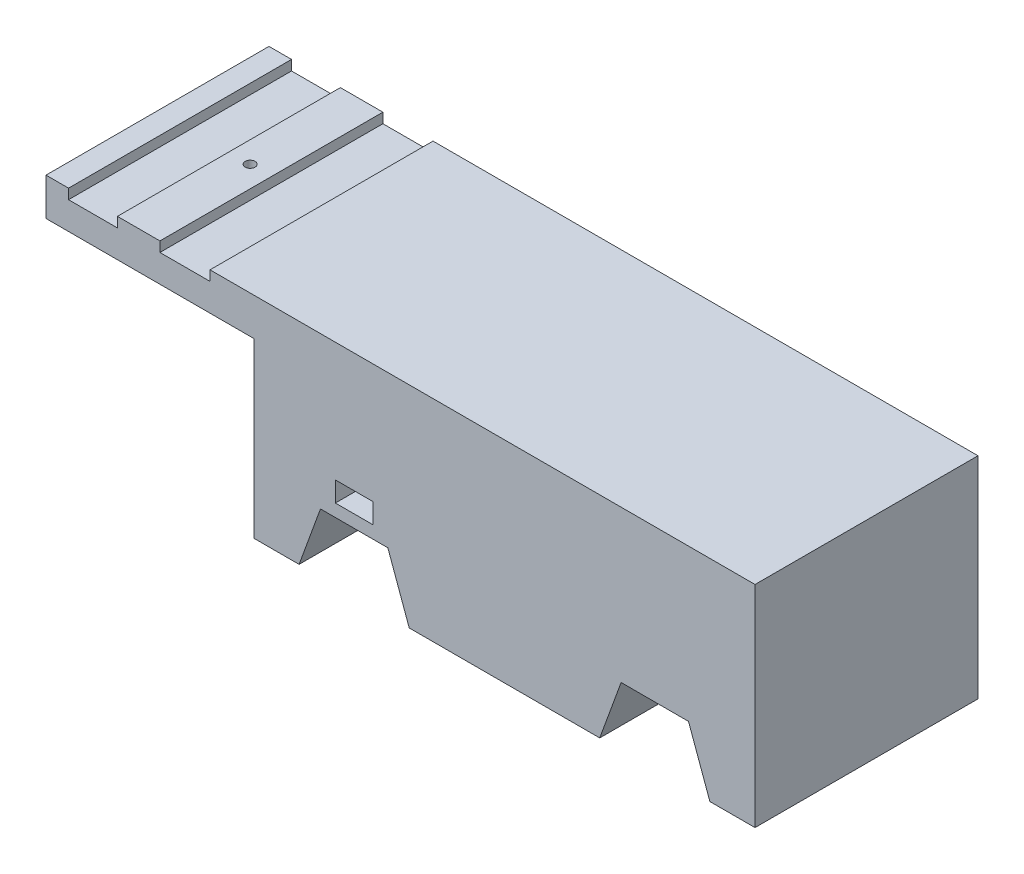
ISO-10303-21;
HEADER;
FILE_DESCRIPTION(('STEP AP214'),'2;1');
FILE_NAME('part.step','',(''),(''),'','','');
FILE_SCHEMA(('AUTOMOTIVE_DESIGN { 1 0 10303 214 1 1 1 1 }'));
ENDSEC;
DATA;
#1=APPLICATION_CONTEXT('core data for automotive mechanical design processes');
#2=APPLICATION_PROTOCOL_DEFINITION('international standard','automotive_design',2000,#1);
#3=PRODUCT_CONTEXT('',#1,'mechanical');
#4=PRODUCT('Part','Part','',(#3));
#5=PRODUCT_RELATED_PRODUCT_CATEGORY('part','',(#4));
#6=PRODUCT_DEFINITION_FORMATION('','',#4);
#7=PRODUCT_DEFINITION_CONTEXT('part definition',#1,'design');
#8=PRODUCT_DEFINITION('design','',#6,#7);
#9=PRODUCT_DEFINITION_SHAPE('','',#8);
#10=(LENGTH_UNIT() NAMED_UNIT(*) SI_UNIT(.MILLI.,.METRE.));
#11=(NAMED_UNIT(*) PLANE_ANGLE_UNIT() SI_UNIT($,.RADIAN.));
#12=(NAMED_UNIT(*) SI_UNIT($,.STERADIAN.) SOLID_ANGLE_UNIT());
#13=UNCERTAINTY_MEASURE_WITH_UNIT(LENGTH_MEASURE(1.E-05),#10,'distance_accuracy_value','');
#14=(GEOMETRIC_REPRESENTATION_CONTEXT(3) GLOBAL_UNCERTAINTY_ASSIGNED_CONTEXT((#13)) GLOBAL_UNIT_ASSIGNED_CONTEXT((#10,
#11,#12)) REPRESENTATION_CONTEXT('',''));
#15=CARTESIAN_POINT('',(0.,0.,0.));
#16=DIRECTION('',(0.,0.,1.));
#17=DIRECTION('',(1.,0.,0.));
#18=AXIS2_PLACEMENT_3D('',#15,#16,#17);
#19=CARTESIAN_POINT('',(-53.4485357832084,-45.6,303.148107475504));
#20=DIRECTION('',(0.,-1.,0.));
#21=DIRECTION('',(0.,0.,-1.));
#22=AXIS2_PLACEMENT_3D('',#19,#20,#21);
#23=PLANE('',#22);
#24=DIRECTION('',(0.,0.,-1.));
#25=VECTOR('',#24,1.);
#26=CARTESIAN_POINT('',(-53.4485357832084,-45.6,303.148107475504));
#27=LINE('',#26,#25);
#28=CARTESIAN_POINT('',(-53.4485357832084,-45.6,89.));
#29=VERTEX_POINT('',#28);
#30=CARTESIAN_POINT('',(-53.4485357832084,-45.6,64.5));
#31=VERTEX_POINT('',#30);
#32=EDGE_CURVE('E393',#29,#31,#27,.T.);
#33=ORIENTED_EDGE('',*,*,#32,.T.);
#34=DIRECTION('',(1.,0.,0.));
#35=VECTOR('',#34,1.);
#36=CARTESIAN_POINT('',(-53.4485357832084,-45.6,64.5));
#37=LINE('',#36,#35);
#38=CARTESIAN_POINT('',(-26.5514642167916,-45.6,64.5));
#39=VERTEX_POINT('',#38);
#40=EDGE_CURVE('E296',#31,#39,#37,.T.);
#41=ORIENTED_EDGE('',*,*,#40,.T.);
#42=DIRECTION('',(0.,0.,-1.));
#43=VECTOR('',#42,1.);
#44=CARTESIAN_POINT('',(-26.5514642167916,-45.6,303.148107475504));
#45=LINE('',#44,#43);
#46=CARTESIAN_POINT('',(-26.5514642167916,-45.6,89.));
#47=VERTEX_POINT('',#46);
#48=EDGE_CURVE('E399',#47,#39,#45,.T.);
#49=ORIENTED_EDGE('',*,*,#48,.F.);
#50=DIRECTION('',(-1.,0.,0.));
#51=VECTOR('',#50,1.);
#52=CARTESIAN_POINT('',(-53.4485357832084,-45.6,89.));
#53=LINE('',#52,#51);
#54=EDGE_CURVE('E394',#47,#29,#53,.T.);
#55=ORIENTED_EDGE('',*,*,#54,.T.);
#56=EDGE_LOOP('',(#33,#41,#49,#55));
#57=FACE_BOUND('',#56,.T.);
#58=ADVANCED_FACE('F38',(#57),#23,.T.);
#59=CARTESIAN_POINT('',(-283.,15.,89.));
#60=DIRECTION('',(1.,0.,0.));
#61=DIRECTION('',(0.,0.,-1.));
#62=AXIS2_PLACEMENT_3D('',#59,#60,#61);
#63=PLANE('',#62);
#64=DIRECTION('',(0.,-1.,0.));
#65=VECTOR('',#64,1.);
#66=CARTESIAN_POINT('',(-283.,15.,0.));
#67=LINE('',#66,#65);
#68=CARTESIAN_POINT('',(-283.,15.,0.));
#69=VERTEX_POINT('',#68);
#70=CARTESIAN_POINT('',(-283.,0.,0.));
#71=VERTEX_POINT('',#70);
#72=EDGE_CURVE('E444',#69,#71,#67,.T.);
#73=ORIENTED_EDGE('',*,*,#72,.T.);
#74=DIRECTION('',(0.,0.,-1.));
#75=VECTOR('',#74,1.);
#76=CARTESIAN_POINT('',(-283.,0.,89.));
#77=LINE('',#76,#75);
#78=CARTESIAN_POINT('',(-283.,0.,89.));
#79=VERTEX_POINT('',#78);
#80=EDGE_CURVE('E560',#79,#71,#77,.T.);
#81=ORIENTED_EDGE('',*,*,#80,.F.);
#82=DIRECTION('',(0.,-1.,0.));
#83=VECTOR('',#82,1.);
#84=CARTESIAN_POINT('',(-283.,15.,89.));
#85=LINE('',#84,#83);
#86=CARTESIAN_POINT('',(-283.,15.,89.));
#87=VERTEX_POINT('',#86);
#88=EDGE_CURVE('E445',#87,#79,#85,.T.);
#89=ORIENTED_EDGE('',*,*,#88,.F.);
#90=DIRECTION('',(0.,0.,-1.));
#91=VECTOR('',#90,1.);
#92=CARTESIAN_POINT('',(-283.,15.,89.));
#93=LINE('',#92,#91);
#94=EDGE_CURVE('E484',#87,#69,#93,.T.);
#95=ORIENTED_EDGE('',*,*,#94,.T.);
#96=EDGE_LOOP('',(#73,#81,#89,#95));
#97=FACE_BOUND('',#96,.T.);
#98=ADVANCED_FACE('F40',(#97),#63,.F.);
#99=CARTESIAN_POINT('',(-283.,0.,89.));
#100=DIRECTION('',(0.,1.,0.));
#101=DIRECTION('',(0.,0.,1.));
#102=AXIS2_PLACEMENT_3D('',#99,#100,#101);
#103=PLANE('',#102);
#104=CARTESIAN_POINT('',(-246.015,0.,44.5));
#105=DIRECTION('',(0.,1.,0.));
#106=DIRECTION('',(0.,0.,1.));
#107=AXIS2_PLACEMENT_3D('',#104,#105,#106);
#108=CIRCLE('',#107,2.);
#109=CARTESIAN_POINT('',(-246.015,0.,46.5));
#110=VERTEX_POINT('',#109);
#111=EDGE_CURVE('E440',#110,#110,#108,.T.);
#112=ORIENTED_EDGE('',*,*,#111,.T.);
#113=EDGE_LOOP('',(#112));
#114=FACE_BOUND('',#113,.T.);
#115=DIRECTION('',(1.,0.,0.));
#116=VECTOR('',#115,1.);
#117=CARTESIAN_POINT('',(-283.,0.,0.));
#118=LINE('',#117,#116);
#119=CARTESIAN_POINT('',(-200.,0.,0.));
#120=VERTEX_POINT('',#119);
#121=EDGE_CURVE('E488',#71,#120,#118,.T.);
#122=ORIENTED_EDGE('',*,*,#121,.T.);
#123=DIRECTION('',(0.,0.,1.));
#124=VECTOR('',#123,1.);
#125=CARTESIAN_POINT('',(-200.,0.,89.));
#126=LINE('',#125,#124);
#127=CARTESIAN_POINT('',(-200.,0.,89.));
#128=VERTEX_POINT('',#127);
#129=EDGE_CURVE('E362',#120,#128,#126,.T.);
#130=ORIENTED_EDGE('',*,*,#129,.T.);
#131=DIRECTION('',(1.,0.,0.));
#132=VECTOR('',#131,1.);
#133=CARTESIAN_POINT('',(-283.,0.,89.));
#134=LINE('',#133,#132);
#135=EDGE_CURVE('E449',#79,#128,#134,.T.);
#136=ORIENTED_EDGE('',*,*,#135,.F.);
#137=ORIENTED_EDGE('',*,*,#80,.T.);
#138=EDGE_LOOP('',(#122,#130,#136,#137));
#139=FACE_BOUND('',#138,.T.);
#140=ADVANCED_FACE('F618',(#114,#139),#103,.F.);
#141=CARTESIAN_POINT('',(0.,0.,89.));
#142=DIRECTION('',(-1.,0.,0.));
#143=DIRECTION('',(0.,0.,1.));
#144=AXIS2_PLACEMENT_3D('',#141,#142,#143);
#145=PLANE('',#144);
#146=DIRECTION('',(0.,0.,-1.));
#147=VECTOR('',#146,1.);
#148=CARTESIAN_POINT('',(0.,15.,89.));
#149=LINE('',#148,#147);
#150=CARTESIAN_POINT('',(0.,15.,89.));
#151=VERTEX_POINT('',#150);
#152=CARTESIAN_POINT('',(0.,15.,0.));
#153=VERTEX_POINT('',#152);
#154=EDGE_CURVE('E556',#151,#153,#149,.T.);
#155=ORIENTED_EDGE('',*,*,#154,.F.);
#156=DIRECTION('',(0.,1.,0.));
#157=VECTOR('',#156,1.);
#158=CARTESIAN_POINT('',(0.,0.,89.));
#159=LINE('',#158,#157);
#160=CARTESIAN_POINT('',(0.,-69.0467957222246,89.));
#161=VERTEX_POINT('',#160);
#162=EDGE_CURVE('E454',#161,#151,#159,.T.);
#163=ORIENTED_EDGE('',*,*,#162,.F.);
#164=DIRECTION('',(0.,0.,-1.));
#165=VECTOR('',#164,1.);
#166=CARTESIAN_POINT('',(0.,-69.0467957222246,303.148107475504));
#167=LINE('',#166,#165);
#168=CARTESIAN_POINT('',(0.,-69.0467957222246,0.));
#169=VERTEX_POINT('',#168);
#170=EDGE_CURVE('E323',#161,#169,#167,.T.);
#171=ORIENTED_EDGE('',*,*,#170,.T.);
#172=DIRECTION('',(0.,1.,0.));
#173=VECTOR('',#172,1.);
#174=CARTESIAN_POINT('',(0.,0.,0.));
#175=LINE('',#174,#173);
#176=EDGE_CURVE('E492',#169,#153,#175,.T.);
#177=ORIENTED_EDGE('',*,*,#176,.T.);
#178=EDGE_LOOP('',(#155,#163,#171,#177));
#179=FACE_BOUND('',#178,.T.);
#180=ADVANCED_FACE('F680',(#179),#145,.F.);
#181=CARTESIAN_POINT('',(0.,15.,89.));
#182=DIRECTION('',(0.,-1.,0.));
#183=DIRECTION('',(1.,0.,0.));
#184=AXIS2_PLACEMENT_3D('',#181,#182,#183);
#185=PLANE('',#184);
#186=DIRECTION('',(-1.,0.,0.));
#187=VECTOR('',#186,1.);
#188=CARTESIAN_POINT('',(0.,15.,0.));
#189=LINE('',#188,#187);
#190=CARTESIAN_POINT('',(-217.53,15.,0.));
#191=VERTEX_POINT('',#190);
#192=EDGE_CURVE('E495',#153,#191,#189,.T.);
#193=ORIENTED_EDGE('',*,*,#192,.T.);
#194=DIRECTION('',(0.,0.,-1.));
#195=VECTOR('',#194,1.);
#196=CARTESIAN_POINT('',(-217.53,15.,89.));
#197=LINE('',#196,#195);
#198=CARTESIAN_POINT('',(-217.53,15.,89.));
#199=VERTEX_POINT('',#198);
#200=EDGE_CURVE('E552',#199,#191,#197,.T.);
#201=ORIENTED_EDGE('',*,*,#200,.F.);
#202=DIRECTION('',(-1.,0.,0.));
#203=VECTOR('',#202,1.);
#204=CARTESIAN_POINT('',(0.,15.,89.));
#205=LINE('',#204,#203);
#206=EDGE_CURVE('E457',#151,#199,#205,.T.);
#207=ORIENTED_EDGE('',*,*,#206,.F.);
#208=ORIENTED_EDGE('',*,*,#154,.T.);
#209=EDGE_LOOP('',(#193,#201,#207,#208));
#210=FACE_BOUND('',#209,.T.);
#211=ADVANCED_FACE('F676',(#210),#185,.F.);
#212=CARTESIAN_POINT('',(-217.53,15.,89.));
#213=DIRECTION('',(1.,0.,0.));
#214=DIRECTION('',(0.,0.,-1.));
#215=AXIS2_PLACEMENT_3D('',#212,#213,#214);
#216=PLANE('',#215);
#217=DIRECTION('',(0.,-1.,0.));
#218=VECTOR('',#217,1.);
#219=CARTESIAN_POINT('',(-217.53,15.,0.));
#220=LINE('',#219,#218);
#221=CARTESIAN_POINT('',(-217.53,11.,0.));
#222=VERTEX_POINT('',#221);
#223=EDGE_CURVE('E498',#191,#222,#220,.T.);
#224=ORIENTED_EDGE('',*,*,#223,.T.);
#225=DIRECTION('',(0.,0.,-1.));
#226=VECTOR('',#225,1.);
#227=CARTESIAN_POINT('',(-217.53,11.,89.));
#228=LINE('',#227,#226);
#229=CARTESIAN_POINT('',(-217.53,11.,89.));
#230=VERTEX_POINT('',#229);
#231=EDGE_CURVE('E548',#230,#222,#228,.T.);
#232=ORIENTED_EDGE('',*,*,#231,.F.);
#233=DIRECTION('',(0.,-1.,0.));
#234=VECTOR('',#233,1.);
#235=CARTESIAN_POINT('',(-217.53,15.,89.));
#236=LINE('',#235,#234);
#237=EDGE_CURVE('E460',#199,#230,#236,.T.);
#238=ORIENTED_EDGE('',*,*,#237,.F.);
#239=ORIENTED_EDGE('',*,*,#200,.T.);
#240=EDGE_LOOP('',(#224,#232,#238,#239));
#241=FACE_BOUND('',#240,.T.);
#242=ADVANCED_FACE('F672',(#241),#216,.F.);
#243=CARTESIAN_POINT('',(-217.53,11.,89.));
#244=DIRECTION('',(0.,-1.,0.));
#245=DIRECTION('',(1.,0.,0.));
#246=AXIS2_PLACEMENT_3D('',#243,#244,#245);
#247=PLANE('',#246);
#248=DIRECTION('',(-1.,0.,0.));
#249=VECTOR('',#248,1.);
#250=CARTESIAN_POINT('',(-217.53,11.,0.));
#251=LINE('',#250,#249);
#252=CARTESIAN_POINT('',(-237.53,11.,0.));
#253=VERTEX_POINT('',#252);
#254=EDGE_CURVE('E501',#222,#253,#251,.T.);
#255=ORIENTED_EDGE('',*,*,#254,.T.);
#256=DIRECTION('',(0.,0.,-1.));
#257=VECTOR('',#256,1.);
#258=CARTESIAN_POINT('',(-237.53,11.,89.));
#259=LINE('',#258,#257);
#260=CARTESIAN_POINT('',(-237.53,11.,89.));
#261=VERTEX_POINT('',#260);
#262=EDGE_CURVE('E544',#261,#253,#259,.T.);
#263=ORIENTED_EDGE('',*,*,#262,.F.);
#264=DIRECTION('',(-1.,0.,0.));
#265=VECTOR('',#264,1.);
#266=CARTESIAN_POINT('',(-217.53,11.,89.));
#267=LINE('',#266,#265);
#268=EDGE_CURVE('E463',#230,#261,#267,.T.);
#269=ORIENTED_EDGE('',*,*,#268,.F.);
#270=ORIENTED_EDGE('',*,*,#231,.T.);
#271=EDGE_LOOP('',(#255,#263,#269,#270));
#272=FACE_BOUND('',#271,.T.);
#273=ADVANCED_FACE('F668',(#272),#247,.F.);
#274=CARTESIAN_POINT('',(-237.53,11.,89.));
#275=DIRECTION('',(-1.,0.,0.));
#276=DIRECTION('',(0.,0.,1.));
#277=AXIS2_PLACEMENT_3D('',#274,#275,#276);
#278=PLANE('',#277);
#279=DIRECTION('',(0.,1.,0.));
#280=VECTOR('',#279,1.);
#281=CARTESIAN_POINT('',(-237.53,11.,0.));
#282=LINE('',#281,#280);
#283=CARTESIAN_POINT('',(-237.53,15.,0.));
#284=VERTEX_POINT('',#283);
#285=EDGE_CURVE('E504',#253,#284,#282,.T.);
#286=ORIENTED_EDGE('',*,*,#285,.T.);
#287=DIRECTION('',(0.,0.,-1.));
#288=VECTOR('',#287,1.);
#289=CARTESIAN_POINT('',(-237.53,15.,89.));
#290=LINE('',#289,#288);
#291=CARTESIAN_POINT('',(-237.53,15.,89.));
#292=VERTEX_POINT('',#291);
#293=EDGE_CURVE('E540',#292,#284,#290,.T.);
#294=ORIENTED_EDGE('',*,*,#293,.F.);
#295=DIRECTION('',(0.,1.,0.));
#296=VECTOR('',#295,1.);
#297=CARTESIAN_POINT('',(-237.53,11.,89.));
#298=LINE('',#297,#296);
#299=EDGE_CURVE('E466',#261,#292,#298,.T.);
#300=ORIENTED_EDGE('',*,*,#299,.F.);
#301=ORIENTED_EDGE('',*,*,#262,.T.);
#302=EDGE_LOOP('',(#286,#294,#300,#301));
#303=FACE_BOUND('',#302,.T.);
#304=ADVANCED_FACE('F664',(#303),#278,.F.);
#305=CARTESIAN_POINT('',(-237.53,15.,89.));
#306=DIRECTION('',(0.,-1.,0.));
#307=DIRECTION('',(1.,0.,0.));
#308=AXIS2_PLACEMENT_3D('',#305,#306,#307);
#309=PLANE('',#308);
#310=CARTESIAN_POINT('',(-246.015,15.0000000000001,44.5));
#311=DIRECTION('',(0.,1.,0.));
#312=DIRECTION('',(-1.,0.,0.));
#313=AXIS2_PLACEMENT_3D('',#310,#311,#312);
#314=CIRCLE('',#313,2.);
#315=CARTESIAN_POINT('',(-248.015,15.0000000000001,44.5));
#316=VERTEX_POINT('',#315);
#317=EDGE_CURVE('E436',#316,#316,#314,.T.);
#318=ORIENTED_EDGE('',*,*,#317,.F.);
#319=EDGE_LOOP('',(#318));
#320=FACE_BOUND('',#319,.T.);
#321=DIRECTION('',(-1.,0.,0.));
#322=VECTOR('',#321,1.);
#323=CARTESIAN_POINT('',(-237.53,15.,0.));
#324=LINE('',#323,#322);
#325=CARTESIAN_POINT('',(-254.5,15.,0.));
#326=VERTEX_POINT('',#325);
#327=EDGE_CURVE('E507',#284,#326,#324,.T.);
#328=ORIENTED_EDGE('',*,*,#327,.T.);
#329=DIRECTION('',(0.,0.,-1.));
#330=VECTOR('',#329,1.);
#331=CARTESIAN_POINT('',(-254.5,15.,89.));
#332=LINE('',#331,#330);
#333=CARTESIAN_POINT('',(-254.5,15.,89.));
#334=VERTEX_POINT('',#333);
#335=EDGE_CURVE('E536',#334,#326,#332,.T.);
#336=ORIENTED_EDGE('',*,*,#335,.F.);
#337=DIRECTION('',(-1.,0.,0.));
#338=VECTOR('',#337,1.);
#339=CARTESIAN_POINT('',(-237.53,15.,89.));
#340=LINE('',#339,#338);
#341=EDGE_CURVE('E469',#292,#334,#340,.T.);
#342=ORIENTED_EDGE('',*,*,#341,.F.);
#343=ORIENTED_EDGE('',*,*,#293,.T.);
#344=EDGE_LOOP('',(#328,#336,#342,#343));
#345=FACE_BOUND('',#344,.T.);
#346=ADVANCED_FACE('F660',(#320,#345),#309,.F.);
#347=CARTESIAN_POINT('',(-254.5,15.,89.));
#348=DIRECTION('',(1.,0.,0.));
#349=DIRECTION('',(0.,0.,-1.));
#350=AXIS2_PLACEMENT_3D('',#347,#348,#349);
#351=PLANE('',#350);
#352=DIRECTION('',(0.,-1.,0.));
#353=VECTOR('',#352,1.);
#354=CARTESIAN_POINT('',(-254.5,15.,0.));
#355=LINE('',#354,#353);
#356=CARTESIAN_POINT('',(-254.5,11.,0.));
#357=VERTEX_POINT('',#356);
#358=EDGE_CURVE('E510',#326,#357,#355,.T.);
#359=ORIENTED_EDGE('',*,*,#358,.T.);
#360=DIRECTION('',(0.,0.,-1.));
#361=VECTOR('',#360,1.);
#362=CARTESIAN_POINT('',(-254.5,11.,89.));
#363=LINE('',#362,#361);
#364=CARTESIAN_POINT('',(-254.5,11.,89.));
#365=VERTEX_POINT('',#364);
#366=EDGE_CURVE('E532',#365,#357,#363,.T.);
#367=ORIENTED_EDGE('',*,*,#366,.F.);
#368=DIRECTION('',(0.,-1.,0.));
#369=VECTOR('',#368,1.);
#370=CARTESIAN_POINT('',(-254.5,15.,89.));
#371=LINE('',#370,#369);
#372=EDGE_CURVE('E472',#334,#365,#371,.T.);
#373=ORIENTED_EDGE('',*,*,#372,.F.);
#374=ORIENTED_EDGE('',*,*,#335,.T.);
#375=EDGE_LOOP('',(#359,#367,#373,#374));
#376=FACE_BOUND('',#375,.T.);
#377=ADVANCED_FACE('F656',(#376),#351,.F.);
#378=CARTESIAN_POINT('',(-254.5,11.,89.));
#379=DIRECTION('',(0.,-1.,0.));
#380=DIRECTION('',(1.,0.,0.));
#381=AXIS2_PLACEMENT_3D('',#378,#379,#380);
#382=PLANE('',#381);
#383=DIRECTION('',(-1.,0.,0.));
#384=VECTOR('',#383,1.);
#385=CARTESIAN_POINT('',(-254.5,11.,0.));
#386=LINE('',#385,#384);
#387=CARTESIAN_POINT('',(-274.,11.,0.));
#388=VERTEX_POINT('',#387);
#389=EDGE_CURVE('E513',#357,#388,#386,.T.);
#390=ORIENTED_EDGE('',*,*,#389,.T.);
#391=DIRECTION('',(0.,0.,-1.));
#392=VECTOR('',#391,1.);
#393=CARTESIAN_POINT('',(-274.,11.,89.));
#394=LINE('',#393,#392);
#395=CARTESIAN_POINT('',(-274.,11.,89.));
#396=VERTEX_POINT('',#395);
#397=EDGE_CURVE('E528',#396,#388,#394,.T.);
#398=ORIENTED_EDGE('',*,*,#397,.F.);
#399=DIRECTION('',(-1.,0.,0.));
#400=VECTOR('',#399,1.);
#401=CARTESIAN_POINT('',(-254.5,11.,89.));
#402=LINE('',#401,#400);
#403=EDGE_CURVE('E475',#365,#396,#402,.T.);
#404=ORIENTED_EDGE('',*,*,#403,.F.);
#405=ORIENTED_EDGE('',*,*,#366,.T.);
#406=EDGE_LOOP('',(#390,#398,#404,#405));
#407=FACE_BOUND('',#406,.T.);
#408=ADVANCED_FACE('F652',(#407),#382,.F.);
#409=CARTESIAN_POINT('',(-274.,11.,89.));
#410=DIRECTION('',(-1.,0.,0.));
#411=DIRECTION('',(0.,0.,1.));
#412=AXIS2_PLACEMENT_3D('',#409,#410,#411);
#413=PLANE('',#412);
#414=DIRECTION('',(0.,1.,0.));
#415=VECTOR('',#414,1.);
#416=CARTESIAN_POINT('',(-274.,11.,0.));
#417=LINE('',#416,#415);
#418=CARTESIAN_POINT('',(-274.,15.,0.));
#419=VERTEX_POINT('',#418);
#420=EDGE_CURVE('E516',#388,#419,#417,.T.);
#421=ORIENTED_EDGE('',*,*,#420,.T.);
#422=DIRECTION('',(0.,0.,-1.));
#423=VECTOR('',#422,1.);
#424=CARTESIAN_POINT('',(-274.,15.,89.));
#425=LINE('',#424,#423);
#426=CARTESIAN_POINT('',(-274.,15.,89.));
#427=VERTEX_POINT('',#426);
#428=EDGE_CURVE('E524',#427,#419,#425,.T.);
#429=ORIENTED_EDGE('',*,*,#428,.F.);
#430=DIRECTION('',(0.,1.,0.));
#431=VECTOR('',#430,1.);
#432=CARTESIAN_POINT('',(-274.,11.,89.));
#433=LINE('',#432,#431);
#434=EDGE_CURVE('E478',#396,#427,#433,.T.);
#435=ORIENTED_EDGE('',*,*,#434,.F.);
#436=ORIENTED_EDGE('',*,*,#397,.T.);
#437=EDGE_LOOP('',(#421,#429,#435,#436));
#438=FACE_BOUND('',#437,.T.);
#439=ADVANCED_FACE('F648',(#438),#413,.F.);
#440=CARTESIAN_POINT('',(-274.,15.,89.));
#441=DIRECTION('',(0.,-1.,0.));
#442=DIRECTION('',(1.,0.,0.));
#443=AXIS2_PLACEMENT_3D('',#440,#441,#442);
#444=PLANE('',#443);
#445=DIRECTION('',(-1.,0.,0.));
#446=VECTOR('',#445,1.);
#447=CARTESIAN_POINT('',(-274.,15.,0.));
#448=LINE('',#447,#446);
#449=EDGE_CURVE('E450',#419,#69,#448,.T.);
#450=ORIENTED_EDGE('',*,*,#449,.T.);
#451=ORIENTED_EDGE('',*,*,#94,.F.);
#452=DIRECTION('',(-1.,0.,0.));
#453=VECTOR('',#452,1.);
#454=CARTESIAN_POINT('',(-274.,15.,89.));
#455=LINE('',#454,#453);
#456=EDGE_CURVE('E481',#427,#87,#455,.T.);
#457=ORIENTED_EDGE('',*,*,#456,.F.);
#458=ORIENTED_EDGE('',*,*,#428,.T.);
#459=EDGE_LOOP('',(#450,#451,#457,#458));
#460=FACE_BOUND('',#459,.T.);
#461=ADVANCED_FACE('F642',(#460),#444,.F.);
#462=CARTESIAN_POINT('',(0.,0.,89.));
#463=DIRECTION('',(0.,0.,1.));
#464=DIRECTION('',(1.,0.,0.));
#465=AXIS2_PLACEMENT_3D('',#462,#463,#464);
#466=PLANE('',#465);
#467=DIRECTION('',(0.,1.,0.));
#468=VECTOR('',#467,1.);
#469=CARTESIAN_POINT('',(-167.5,-40.6,89.));
#470=LINE('',#469,#468);
#471=CARTESIAN_POINT('',(-167.5,-40.6,89.));
#472=VERTEX_POINT('',#471);
#473=CARTESIAN_POINT('',(-167.5,-32.6,89.));
#474=VERTEX_POINT('',#473);
#475=EDGE_CURVE('E238',#472,#474,#470,.T.);
#476=ORIENTED_EDGE('',*,*,#475,.T.);
#477=DIRECTION('',(1.,0.,0.));
#478=VECTOR('',#477,1.);
#479=CARTESIAN_POINT('',(-152.5,-32.6,89.));
#480=LINE('',#479,#478);
#481=CARTESIAN_POINT('',(-152.5,-32.6,89.));
#482=VERTEX_POINT('',#481);
#483=EDGE_CURVE('E248',#474,#482,#480,.T.);
#484=ORIENTED_EDGE('',*,*,#483,.T.);
#485=DIRECTION('',(0.,-1.,0.));
#486=VECTOR('',#485,1.);
#487=CARTESIAN_POINT('',(-152.5,-40.6,89.));
#488=LINE('',#487,#486);
#489=CARTESIAN_POINT('',(-152.5,-40.6,89.));
#490=VERTEX_POINT('',#489);
#491=EDGE_CURVE('E55',#482,#490,#488,.T.);
#492=ORIENTED_EDGE('',*,*,#491,.T.);
#493=DIRECTION('',(-1.,0.,0.));
#494=VECTOR('',#493,1.);
#495=CARTESIAN_POINT('',(-152.5,-40.6,89.));
#496=LINE('',#495,#494);
#497=EDGE_CURVE('E245',#490,#472,#496,.T.);
#498=ORIENTED_EDGE('',*,*,#497,.T.);
#499=EDGE_LOOP('',(#476,#484,#492,#498));
#500=FACE_BOUND('',#499,.T.);
#501=ORIENTED_EDGE('',*,*,#135,.T.);
#502=DIRECTION('',(0.,1.,0.));
#503=VECTOR('',#502,1.);
#504=CARTESIAN_POINT('',(-200.,-61.6,89.));
#505=LINE('',#504,#503);
#506=CARTESIAN_POINT('',(-200.,-69.0467957222246,89.));
#507=VERTEX_POINT('',#506);
#508=EDGE_CURVE('E359',#507,#128,#505,.T.);
#509=ORIENTED_EDGE('',*,*,#508,.F.);
#510=DIRECTION('',(-1.,0.,0.));
#511=VECTOR('',#510,1.);
#512=CARTESIAN_POINT('',(-181.982471515018,-69.0467957222246,89.));
#513=LINE('',#512,#511);
#514=CARTESIAN_POINT('',(-181.982471515018,-69.0467957222246,89.));
#515=VERTEX_POINT('',#514);
#516=EDGE_CURVE('E364',#515,#507,#513,.T.);
#517=ORIENTED_EDGE('',*,*,#516,.F.);
#518=DIRECTION('',(-0.342020143325666,-0.93969262078591,0.));
#519=VECTOR('',#518,1.);
#520=CARTESIAN_POINT('',(-173.448535783208,-45.6,89.));
#521=LINE('',#520,#519);
#522=CARTESIAN_POINT('',(-173.448535783208,-45.6,89.));
#523=VERTEX_POINT('',#522);
#524=EDGE_CURVE('E369',#523,#515,#521,.T.);
#525=ORIENTED_EDGE('',*,*,#524,.F.);
#526=DIRECTION('',(-1.,0.,0.));
#527=VECTOR('',#526,1.);
#528=CARTESIAN_POINT('',(-146.551464216792,-45.6,89.));
#529=LINE('',#528,#527);
#530=CARTESIAN_POINT('',(-146.551464216792,-45.6,89.));
#531=VERTEX_POINT('',#530);
#532=EDGE_CURVE('E374',#531,#523,#529,.T.);
#533=ORIENTED_EDGE('',*,*,#532,.F.);
#534=DIRECTION('',(-0.342020143325665,0.93969262078591,0.));
#535=VECTOR('',#534,1.);
#536=CARTESIAN_POINT('',(-146.551464216792,-45.6,89.));
#537=LINE('',#536,#535);
#538=CARTESIAN_POINT('',(-138.017528484982,-69.0467957222246,89.));
#539=VERTEX_POINT('',#538);
#540=EDGE_CURVE('E379',#539,#531,#537,.T.);
#541=ORIENTED_EDGE('',*,*,#540,.F.);
#542=DIRECTION('',(-1.,0.,0.));
#543=VECTOR('',#542,1.);
#544=CARTESIAN_POINT('',(-61.9824715150182,-69.0467957222246,89.));
#545=LINE('',#544,#543);
#546=CARTESIAN_POINT('',(-61.9824715150182,-69.0467957222246,89.));
#547=VERTEX_POINT('',#546);
#548=EDGE_CURVE('E384',#547,#539,#545,.T.);
#549=ORIENTED_EDGE('',*,*,#548,.F.);
#550=DIRECTION('',(-0.342020143325667,-0.939692620785909,0.));
#551=VECTOR('',#550,1.);
#552=CARTESIAN_POINT('',(-53.4485357832084,-45.6,89.));
#553=LINE('',#552,#551);
#554=EDGE_CURVE('E389',#29,#547,#553,.T.);
#555=ORIENTED_EDGE('',*,*,#554,.F.);
#556=ORIENTED_EDGE('',*,*,#54,.F.);
#557=DIRECTION('',(-0.342020143325665,0.93969262078591,0.));
#558=VECTOR('',#557,1.);
#559=CARTESIAN_POINT('',(-26.5514642167916,-45.6,89.));
#560=LINE('',#559,#558);
#561=CARTESIAN_POINT('',(-18.0175284849818,-69.0467957222246,89.));
#562=VERTEX_POINT('',#561);
#563=EDGE_CURVE('E400',#562,#47,#560,.T.);
#564=ORIENTED_EDGE('',*,*,#563,.F.);
#565=DIRECTION('',(-1.,0.,0.));
#566=VECTOR('',#565,1.);
#567=CARTESIAN_POINT('',(0.,-69.0467957222246,89.));
#568=LINE('',#567,#566);
#569=EDGE_CURVE('E406',#161,#562,#568,.T.);
#570=ORIENTED_EDGE('',*,*,#569,.F.);
#571=ORIENTED_EDGE('',*,*,#162,.T.);
#572=ORIENTED_EDGE('',*,*,#206,.T.);
#573=ORIENTED_EDGE('',*,*,#237,.T.);
#574=ORIENTED_EDGE('',*,*,#268,.T.);
#575=ORIENTED_EDGE('',*,*,#299,.T.);
#576=ORIENTED_EDGE('',*,*,#341,.T.);
#577=ORIENTED_EDGE('',*,*,#372,.T.);
#578=ORIENTED_EDGE('',*,*,#403,.T.);
#579=ORIENTED_EDGE('',*,*,#434,.T.);
#580=ORIENTED_EDGE('',*,*,#456,.T.);
#581=ORIENTED_EDGE('',*,*,#88,.T.);
#582=EDGE_LOOP('',(#501,#509,#517,#525,#533,#541,#549,#555,#556,#564,#570,#571,#572,#573,#574,
#575,#576,#577,#578,#579,#580,#581));
#583=FACE_BOUND('',#582,.T.);
#584=ADVANCED_FACE('F253',(#500,#583),#466,.T.);
#585=CARTESIAN_POINT('',(0.,0.,0.));
#586=DIRECTION('',(0.,0.,1.));
#587=DIRECTION('',(1.,0.,0.));
#588=AXIS2_PLACEMENT_3D('',#585,#586,#587);
#589=PLANE('',#588);
#590=DIRECTION('',(1.,0.,0.));
#591=VECTOR('',#590,1.);
#592=CARTESIAN_POINT('',(-152.5,-32.6,0.));
#593=LINE('',#592,#591);
#594=CARTESIAN_POINT('',(-167.5,-32.6,0.));
#595=VERTEX_POINT('',#594);
#596=CARTESIAN_POINT('',(-152.5,-32.6,0.));
#597=VERTEX_POINT('',#596);
#598=EDGE_CURVE('E273',#595,#597,#593,.T.);
#599=ORIENTED_EDGE('',*,*,#598,.F.);
#600=DIRECTION('',(0.,1.,0.));
#601=VECTOR('',#600,1.);
#602=CARTESIAN_POINT('',(-167.5,-40.6,0.));
#603=LINE('',#602,#601);
#604=CARTESIAN_POINT('',(-167.5,-40.6,0.));
#605=VERTEX_POINT('',#604);
#606=EDGE_CURVE('E63',#605,#595,#603,.T.);
#607=ORIENTED_EDGE('',*,*,#606,.F.);
#608=DIRECTION('',(-1.,0.,0.));
#609=VECTOR('',#608,1.);
#610=CARTESIAN_POINT('',(-152.5,-40.6,0.));
#611=LINE('',#610,#609);
#612=CARTESIAN_POINT('',(-152.5,-40.6,0.));
#613=VERTEX_POINT('',#612);
#614=EDGE_CURVE('E257',#613,#605,#611,.T.);
#615=ORIENTED_EDGE('',*,*,#614,.F.);
#616=DIRECTION('',(0.,-1.,0.));
#617=VECTOR('',#616,1.);
#618=CARTESIAN_POINT('',(-152.5,-40.6,0.));
#619=LINE('',#618,#617);
#620=EDGE_CURVE('E261',#597,#613,#619,.T.);
#621=ORIENTED_EDGE('',*,*,#620,.F.);
#622=EDGE_LOOP('',(#599,#607,#615,#621));
#623=FACE_BOUND('',#622,.T.);
#624=ORIENTED_EDGE('',*,*,#176,.F.);
#625=DIRECTION('',(-1.,0.,0.));
#626=VECTOR('',#625,1.);
#627=CARTESIAN_POINT('',(0.,-69.0467957222246,0.));
#628=LINE('',#627,#626);
#629=CARTESIAN_POINT('',(-18.0175284849818,-69.0467957222246,0.));
#630=VERTEX_POINT('',#629);
#631=EDGE_CURVE('E318',#169,#630,#628,.T.);
#632=ORIENTED_EDGE('',*,*,#631,.T.);
#633=DIRECTION('',(-0.342020143325665,0.93969262078591,0.));
#634=VECTOR('',#633,1.);
#635=CARTESIAN_POINT('',(-26.5514642167916,-45.6,0.));
#636=LINE('',#635,#634);
#637=CARTESIAN_POINT('',(-26.5514642167916,-45.6,0.));
#638=VERTEX_POINT('',#637);
#639=EDGE_CURVE('E352',#630,#638,#636,.T.);
#640=ORIENTED_EDGE('',*,*,#639,.T.);
#641=DIRECTION('',(-1.,0.,0.));
#642=VECTOR('',#641,1.);
#643=CARTESIAN_POINT('',(-53.4485357832084,-45.6,0.));
#644=LINE('',#643,#642);
#645=CARTESIAN_POINT('',(-53.4485357832084,-45.6,0.));
#646=VERTEX_POINT('',#645);
#647=EDGE_CURVE('E348',#638,#646,#644,.T.);
#648=ORIENTED_EDGE('',*,*,#647,.T.);
#649=DIRECTION('',(-0.342020143325667,-0.939692620785909,0.));
#650=VECTOR('',#649,1.);
#651=CARTESIAN_POINT('',(-53.4485357832084,-45.6,0.));
#652=LINE('',#651,#650);
#653=CARTESIAN_POINT('',(-61.9824715150182,-69.0467957222246,0.));
#654=VERTEX_POINT('',#653);
#655=EDGE_CURVE('E344',#646,#654,#652,.T.);
#656=ORIENTED_EDGE('',*,*,#655,.T.);
#657=DIRECTION('',(-1.,0.,0.));
#658=VECTOR('',#657,1.);
#659=CARTESIAN_POINT('',(-61.9824715150182,-69.0467957222246,0.));
#660=LINE('',#659,#658);
#661=CARTESIAN_POINT('',(-138.017528484982,-69.0467957222246,0.));
#662=VERTEX_POINT('',#661);
#663=EDGE_CURVE('E340',#654,#662,#660,.T.);
#664=ORIENTED_EDGE('',*,*,#663,.T.);
#665=DIRECTION('',(-0.342020143325665,0.93969262078591,0.));
#666=VECTOR('',#665,1.);
#667=CARTESIAN_POINT('',(-146.551464216792,-45.6,0.));
#668=LINE('',#667,#666);
#669=CARTESIAN_POINT('',(-146.551464216792,-45.6,0.));
#670=VERTEX_POINT('',#669);
#671=EDGE_CURVE('E336',#662,#670,#668,.T.);
#672=ORIENTED_EDGE('',*,*,#671,.T.);
#673=DIRECTION('',(-1.,0.,0.));
#674=VECTOR('',#673,1.);
#675=CARTESIAN_POINT('',(-146.551464216792,-45.6,0.));
#676=LINE('',#675,#674);
#677=CARTESIAN_POINT('',(-173.448535783208,-45.6,0.));
#678=VERTEX_POINT('',#677);
#679=EDGE_CURVE('E332',#670,#678,#676,.T.);
#680=ORIENTED_EDGE('',*,*,#679,.T.);
#681=DIRECTION('',(-0.342020143325666,-0.939692620785909,0.));
#682=VECTOR('',#681,1.);
#683=CARTESIAN_POINT('',(-173.448535783208,-45.6,0.));
#684=LINE('',#683,#682);
#685=CARTESIAN_POINT('',(-181.982471515018,-69.0467957222246,0.));
#686=VERTEX_POINT('',#685);
#687=EDGE_CURVE('E328',#678,#686,#684,.T.);
#688=ORIENTED_EDGE('',*,*,#687,.T.);
#689=DIRECTION('',(-1.,0.,0.));
#690=VECTOR('',#689,1.);
#691=CARTESIAN_POINT('',(-181.982471515018,-69.0467957222246,0.));
#692=LINE('',#691,#690);
#693=CARTESIAN_POINT('',(-200.,-69.0467957222246,0.));
#694=VERTEX_POINT('',#693);
#695=EDGE_CURVE('E324',#686,#694,#692,.T.);
#696=ORIENTED_EDGE('',*,*,#695,.T.);
#697=DIRECTION('',(0.,1.,0.));
#698=VECTOR('',#697,1.);
#699=CARTESIAN_POINT('',(-200.,-61.6,0.));
#700=LINE('',#699,#698);
#701=EDGE_CURVE('E319',#694,#120,#700,.T.);
#702=ORIENTED_EDGE('',*,*,#701,.T.);
#703=ORIENTED_EDGE('',*,*,#121,.F.);
#704=ORIENTED_EDGE('',*,*,#72,.F.);
#705=ORIENTED_EDGE('',*,*,#449,.F.);
#706=ORIENTED_EDGE('',*,*,#420,.F.);
#707=ORIENTED_EDGE('',*,*,#389,.F.);
#708=ORIENTED_EDGE('',*,*,#358,.F.);
#709=ORIENTED_EDGE('',*,*,#327,.F.);
#710=ORIENTED_EDGE('',*,*,#285,.F.);
#711=ORIENTED_EDGE('',*,*,#254,.F.);
#712=ORIENTED_EDGE('',*,*,#223,.F.);
#713=ORIENTED_EDGE('',*,*,#192,.F.);
#714=EDGE_LOOP('',(#624,#632,#640,#648,#656,#664,#672,#680,#688,#696,#702,#703,#704,#705,#706,
#707,#708,#709,#710,#711,#712,#713));
#715=FACE_BOUND('',#714,.T.);
#716=ADVANCED_FACE('F638',(#623,#715),#589,.F.);
#717=CARTESIAN_POINT('',(-246.015,-10.9999999999999,44.5));
#718=DIRECTION('',(0.,1.,0.));
#719=DIRECTION('',(-1.,0.,0.));
#720=AXIS2_PLACEMENT_3D('',#717,#718,#719);
#721=CYLINDRICAL_SURFACE('',#720,2.);
#722=ORIENTED_EDGE('',*,*,#317,.T.);
#723=EDGE_LOOP('',(#722));
#724=FACE_BOUND('',#723,.T.);
#725=ORIENTED_EDGE('',*,*,#111,.F.);
#726=EDGE_LOOP('',(#725));
#727=FACE_BOUND('',#726,.T.);
#728=ADVANCED_FACE('F636',(#724,#727),#721,.F.);
#729=CARTESIAN_POINT('',(-200.,-61.6,303.148107475504));
#730=DIRECTION('',(-1.,0.,0.));
#731=DIRECTION('',(0.,-1.,0.));
#732=AXIS2_PLACEMENT_3D('',#729,#730,#731);
#733=PLANE('',#732);
#734=ORIENTED_EDGE('',*,*,#129,.F.);
#735=ORIENTED_EDGE('',*,*,#701,.F.);
#736=DIRECTION('',(0.,0.,-1.));
#737=VECTOR('',#736,1.);
#738=CARTESIAN_POINT('',(-200.,-69.0467957222246,303.148107475504));
#739=LINE('',#738,#737);
#740=EDGE_CURVE('E363',#507,#694,#739,.T.);
#741=ORIENTED_EDGE('',*,*,#740,.F.);
#742=ORIENTED_EDGE('',*,*,#508,.T.);
#743=EDGE_LOOP('',(#734,#735,#741,#742));
#744=FACE_BOUND('',#743,.T.);
#745=ADVANCED_FACE('F632',(#744),#733,.T.);
#746=CARTESIAN_POINT('',(0.,-69.0467957222246,303.148107475504));
#747=DIRECTION('',(0.,-1.,0.));
#748=DIRECTION('',(0.,0.,-1.));
#749=AXIS2_PLACEMENT_3D('',#746,#747,#748);
#750=PLANE('',#749);
#751=ORIENTED_EDGE('',*,*,#170,.F.);
#752=ORIENTED_EDGE('',*,*,#569,.T.);
#753=DIRECTION('',(0.,0.,-1.));
#754=VECTOR('',#753,1.);
#755=CARTESIAN_POINT('',(-18.0175284849818,-69.0467957222246,303.148107475504));
#756=LINE('',#755,#754);
#757=EDGE_CURVE('E405',#562,#630,#756,.T.);
#758=ORIENTED_EDGE('',*,*,#757,.T.);
#759=ORIENTED_EDGE('',*,*,#631,.F.);
#760=EDGE_LOOP('',(#751,#752,#758,#759));
#761=FACE_BOUND('',#760,.T.);
#762=ADVANCED_FACE('F628',(#761),#750,.T.);
#763=CARTESIAN_POINT('',(-26.5514642167916,-45.6,303.148107475504));
#764=DIRECTION('',(-0.93969262078591,-0.342020143325665,0.));
#765=DIRECTION('',(0.342020143325665,-0.93969262078591,0.));
#766=AXIS2_PLACEMENT_3D('',#763,#764,#765);
#767=PLANE('',#766);
#768=DIRECTION('',(0.342020143325665,-0.93969262078591,0.));
#769=VECTOR('',#768,1.);
#770=CARTESIAN_POINT('',(-26.5514642167916,-45.6,24.5));
#771=LINE('',#770,#769);
#772=CARTESIAN_POINT('',(-26.5514642167916,-45.6,24.5));
#773=VERTEX_POINT('',#772);
#774=CARTESIAN_POINT('',(-19.4734094220466,-65.0467957222246,24.5));
#775=VERTEX_POINT('',#774);
#776=EDGE_CURVE('E311',#773,#775,#771,.T.);
#777=ORIENTED_EDGE('',*,*,#776,.F.);
#778=EDGE_CURVE('E404',#773,#638,#45,.T.);
#779=ORIENTED_EDGE('',*,*,#778,.T.);
#780=ORIENTED_EDGE('',*,*,#639,.F.);
#781=ORIENTED_EDGE('',*,*,#757,.F.);
#782=ORIENTED_EDGE('',*,*,#563,.T.);
#783=ORIENTED_EDGE('',*,*,#48,.T.);
#784=DIRECTION('',(0.342020143325665,-0.93969262078591,0.));
#785=VECTOR('',#784,1.);
#786=CARTESIAN_POINT('',(-26.5514642167916,-45.6,64.5));
#787=LINE('',#786,#785);
#788=CARTESIAN_POINT('',(-19.4734094220466,-65.0467957222246,64.5));
#789=VERTEX_POINT('',#788);
#790=EDGE_CURVE('E304',#39,#789,#787,.T.);
#791=ORIENTED_EDGE('',*,*,#790,.T.);
#792=DIRECTION('',(0.,0.,-1.));
#793=VECTOR('',#792,1.);
#794=CARTESIAN_POINT('',(-19.4734094220466,-65.0467957222246,303.148107475504));
#795=LINE('',#794,#793);
#796=EDGE_CURVE('E314',#789,#775,#795,.T.);
#797=ORIENTED_EDGE('',*,*,#796,.T.);
#798=EDGE_LOOP('',(#777,#779,#780,#781,#782,#783,#791,#797));
#799=FACE_BOUND('',#798,.T.);
#800=ADVANCED_FACE('F585',(#799),#767,.T.);
#801=DIRECTION('',(1.,0.,0.));
#802=VECTOR('',#801,1.);
#803=CARTESIAN_POINT('',(-53.4485357832084,-45.6,24.5));
#804=LINE('',#803,#802);
#805=CARTESIAN_POINT('',(-53.4485357832084,-45.6,24.5));
#806=VERTEX_POINT('',#805);
#807=EDGE_CURVE('E308',#806,#773,#804,.T.);
#808=ORIENTED_EDGE('',*,*,#807,.F.);
#809=EDGE_CURVE('E398',#806,#646,#27,.T.);
#810=ORIENTED_EDGE('',*,*,#809,.T.);
#811=ORIENTED_EDGE('',*,*,#647,.F.);
#812=ORIENTED_EDGE('',*,*,#778,.F.);
#813=EDGE_LOOP('',(#808,#810,#811,#812));
#814=FACE_BOUND('',#813,.T.);
#815=ADVANCED_FACE('F589',(#814),#23,.T.);
#816=CARTESIAN_POINT('',(-53.4485357832084,-45.6,303.148107475504));
#817=DIRECTION('',(0.939692620785909,-0.342020143325667,0.));
#818=DIRECTION('',(0.342020143325667,0.939692620785909,0.));
#819=AXIS2_PLACEMENT_3D('',#816,#817,#818);
#820=PLANE('',#819);
#821=DIRECTION('',(0.342020143325667,0.939692620785909,0.));
#822=VECTOR('',#821,1.);
#823=CARTESIAN_POINT('',(-53.4485357832084,-45.6,24.5));
#824=LINE('',#823,#822);
#825=CARTESIAN_POINT('',(-60.5265905779534,-65.0467957222246,24.5));
#826=VERTEX_POINT('',#825);
#827=EDGE_CURVE('E11',#826,#806,#824,.T.);
#828=ORIENTED_EDGE('',*,*,#827,.F.);
#829=DIRECTION('',(0.,0.,1.));
#830=VECTOR('',#829,1.);
#831=CARTESIAN_POINT('',(-60.5265905779534,-65.0467957222246,303.148107475504));
#832=LINE('',#831,#830);
#833=CARTESIAN_POINT('',(-60.5265905779534,-65.0467957222246,64.5));
#834=VERTEX_POINT('',#833);
#835=EDGE_CURVE('E48',#826,#834,#832,.T.);
#836=ORIENTED_EDGE('',*,*,#835,.T.);
#837=DIRECTION('',(0.342020143325667,0.939692620785909,0.));
#838=VECTOR('',#837,1.);
#839=CARTESIAN_POINT('',(-53.4485357832084,-45.6,64.5));
#840=LINE('',#839,#838);
#841=EDGE_CURVE('E564',#834,#31,#840,.T.);
#842=ORIENTED_EDGE('',*,*,#841,.T.);
#843=ORIENTED_EDGE('',*,*,#32,.F.);
#844=ORIENTED_EDGE('',*,*,#554,.T.);
#845=DIRECTION('',(0.,0.,-1.));
#846=VECTOR('',#845,1.);
#847=CARTESIAN_POINT('',(-61.9824715150182,-69.0467957222246,303.148107475504));
#848=LINE('',#847,#846);
#849=EDGE_CURVE('E388',#547,#654,#848,.T.);
#850=ORIENTED_EDGE('',*,*,#849,.T.);
#851=ORIENTED_EDGE('',*,*,#655,.F.);
#852=ORIENTED_EDGE('',*,*,#809,.F.);
#853=EDGE_LOOP('',(#828,#836,#842,#843,#844,#850,#851,#852));
#854=FACE_BOUND('',#853,.T.);
#855=ADVANCED_FACE('F572',(#854),#820,.T.);
#856=CARTESIAN_POINT('',(-61.9824715150182,-69.0467957222246,303.148107475504));
#857=DIRECTION('',(0.,-1.,0.));
#858=DIRECTION('',(0.,0.,-1.));
#859=AXIS2_PLACEMENT_3D('',#856,#857,#858);
#860=PLANE('',#859);
#861=ORIENTED_EDGE('',*,*,#849,.F.);
#862=ORIENTED_EDGE('',*,*,#548,.T.);
#863=DIRECTION('',(0.,0.,-1.));
#864=VECTOR('',#863,1.);
#865=CARTESIAN_POINT('',(-138.017528484982,-69.0467957222246,303.148107475504));
#866=LINE('',#865,#864);
#867=EDGE_CURVE('E383',#539,#662,#866,.T.);
#868=ORIENTED_EDGE('',*,*,#867,.T.);
#869=ORIENTED_EDGE('',*,*,#663,.F.);
#870=EDGE_LOOP('',(#861,#862,#868,#869));
#871=FACE_BOUND('',#870,.T.);
#872=ADVANCED_FACE('F627',(#871),#860,.T.);
#873=CARTESIAN_POINT('',(-146.551464216792,-45.6,303.148107475504));
#874=DIRECTION('',(-0.93969262078591,-0.342020143325665,0.));
#875=DIRECTION('',(0.342020143325665,-0.93969262078591,0.));
#876=AXIS2_PLACEMENT_3D('',#873,#874,#875);
#877=PLANE('',#876);
#878=ORIENTED_EDGE('',*,*,#867,.F.);
#879=ORIENTED_EDGE('',*,*,#540,.T.);
#880=DIRECTION('',(0.,0.,-1.));
#881=VECTOR('',#880,1.);
#882=CARTESIAN_POINT('',(-146.551464216792,-45.6,303.148107475504));
#883=LINE('',#882,#881);
#884=EDGE_CURVE('E378',#531,#670,#883,.T.);
#885=ORIENTED_EDGE('',*,*,#884,.T.);
#886=ORIENTED_EDGE('',*,*,#671,.F.);
#887=EDGE_LOOP('',(#878,#879,#885,#886));
#888=FACE_BOUND('',#887,.T.);
#889=ADVANCED_FACE('F742',(#888),#877,.T.);
#890=CARTESIAN_POINT('',(-146.551464216792,-45.6,303.148107475504));
#891=DIRECTION('',(0.,-1.,0.));
#892=DIRECTION('',(0.,0.,-1.));
#893=AXIS2_PLACEMENT_3D('',#890,#891,#892);
#894=PLANE('',#893);
#895=CARTESIAN_POINT('',(-160.,-45.6,74.));
#896=DIRECTION('',(0.,-1.,0.));
#897=DIRECTION('',(0.,0.,-1.));
#898=AXIS2_PLACEMENT_3D('',#895,#896,#897);
#899=CIRCLE('',#898,2.5);
#900=CARTESIAN_POINT('',(-160.,-45.6,71.5));
#901=VERTEX_POINT('',#900);
#902=EDGE_CURVE('E912',#901,#901,#899,.T.);
#903=ORIENTED_EDGE('',*,*,#902,.F.);
#904=EDGE_LOOP('',(#903));
#905=FACE_BOUND('',#904,.T.);
#906=CARTESIAN_POINT('',(-160.,-45.6,15.));
#907=DIRECTION('',(0.,-1.,0.));
#908=DIRECTION('',(0.,0.,-1.));
#909=AXIS2_PLACEMENT_3D('',#906,#907,#908);
#910=CIRCLE('',#909,2.5);
#911=CARTESIAN_POINT('',(-160.,-45.6,12.5));
#912=VERTEX_POINT('',#911);
#913=EDGE_CURVE('E913',#912,#912,#910,.T.);
#914=ORIENTED_EDGE('',*,*,#913,.F.);
#915=EDGE_LOOP('',(#914));
#916=FACE_BOUND('',#915,.T.);
#917=ORIENTED_EDGE('',*,*,#884,.F.);
#918=ORIENTED_EDGE('',*,*,#532,.T.);
#919=DIRECTION('',(0.,0.,-1.));
#920=VECTOR('',#919,1.);
#921=CARTESIAN_POINT('',(-173.448535783208,-45.6,303.148107475504));
#922=LINE('',#921,#920);
#923=EDGE_CURVE('E373',#523,#678,#922,.T.);
#924=ORIENTED_EDGE('',*,*,#923,.T.);
#925=ORIENTED_EDGE('',*,*,#679,.F.);
#926=EDGE_LOOP('',(#917,#918,#924,#925));
#927=FACE_BOUND('',#926,.T.);
#928=ADVANCED_FACE('F745',(#905,#916,#927),#894,.T.);
#929=CARTESIAN_POINT('',(-173.448535783208,-45.6,303.148107475504));
#930=DIRECTION('',(0.939692620785909,-0.342020143325666,0.));
#931=DIRECTION('',(0.342020143325666,0.93969262078591,0.));
#932=AXIS2_PLACEMENT_3D('',#929,#930,#931);
#933=PLANE('',#932);
#934=ORIENTED_EDGE('',*,*,#923,.F.);
#935=ORIENTED_EDGE('',*,*,#524,.T.);
#936=DIRECTION('',(0.,0.,-1.));
#937=VECTOR('',#936,1.);
#938=CARTESIAN_POINT('',(-181.982471515018,-69.0467957222246,303.148107475504));
#939=LINE('',#938,#937);
#940=EDGE_CURVE('E368',#515,#686,#939,.T.);
#941=ORIENTED_EDGE('',*,*,#940,.T.);
#942=ORIENTED_EDGE('',*,*,#687,.F.);
#943=EDGE_LOOP('',(#934,#935,#941,#942));
#944=FACE_BOUND('',#943,.T.);
#945=ADVANCED_FACE('F749',(#944),#933,.T.);
#946=CARTESIAN_POINT('',(-181.982471515018,-69.0467957222246,303.148107475504));
#947=DIRECTION('',(0.,-1.,0.));
#948=DIRECTION('',(1.,0.,0.));
#949=AXIS2_PLACEMENT_3D('',#946,#947,#948);
#950=PLANE('',#949);
#951=ORIENTED_EDGE('',*,*,#940,.F.);
#952=ORIENTED_EDGE('',*,*,#516,.T.);
#953=ORIENTED_EDGE('',*,*,#740,.T.);
#954=ORIENTED_EDGE('',*,*,#695,.F.);
#955=EDGE_LOOP('',(#951,#952,#953,#954));
#956=FACE_BOUND('',#955,.T.);
#957=ADVANCED_FACE('F751',(#956),#950,.T.);
#958=CARTESIAN_POINT('',(-16.2365476428353,-65.0467957222246,24.5));
#959=DIRECTION('',(0.,1.,0.));
#960=DIRECTION('',(0.,0.,1.));
#961=AXIS2_PLACEMENT_3D('',#958,#959,#960);
#962=PLANE('',#961);
#963=ORIENTED_EDGE('',*,*,#796,.F.);
#964=DIRECTION('',(-1.,0.,0.));
#965=VECTOR('',#964,1.);
#966=CARTESIAN_POINT('',(-16.2365476428353,-65.0467957222246,64.5));
#967=LINE('',#966,#965);
#968=EDGE_CURVE('E297',#789,#834,#967,.T.);
#969=ORIENTED_EDGE('',*,*,#968,.T.);
#970=ORIENTED_EDGE('',*,*,#835,.F.);
#971=DIRECTION('',(-1.,0.,0.));
#972=VECTOR('',#971,1.);
#973=CARTESIAN_POINT('',(-16.2365476428353,-65.0467957222246,24.5));
#974=LINE('',#973,#972);
#975=EDGE_CURVE('E292',#775,#826,#974,.T.);
#976=ORIENTED_EDGE('',*,*,#975,.F.);
#977=EDGE_LOOP('',(#963,#969,#970,#976));
#978=FACE_BOUND('',#977,.T.);
#979=ADVANCED_FACE('F577',(#978),#962,.F.);
#980=CARTESIAN_POINT('',(0.,0.,24.5));
#981=DIRECTION('',(0.,0.,-1.));
#982=DIRECTION('',(-1.,0.,0.));
#983=AXIS2_PLACEMENT_3D('',#980,#981,#982);
#984=PLANE('',#983);
#985=CARTESIAN_POINT('',(-40.,-61.6,24.5));
#986=DIRECTION('',(0.,0.,-1.));
#987=DIRECTION('',(-1.,0.,0.));
#988=AXIS2_PLACEMENT_3D('',#985,#986,#987);
#989=CIRCLE('',#988,2.5);
#990=CARTESIAN_POINT('',(-42.5,-61.6,24.5));
#991=VERTEX_POINT('',#990);
#992=EDGE_CURVE('E283',#991,#991,#989,.T.);
#993=ORIENTED_EDGE('',*,*,#992,.F.);
#994=EDGE_LOOP('',(#993));
#995=FACE_BOUND('',#994,.T.);
#996=ORIENTED_EDGE('',*,*,#807,.T.);
#997=ORIENTED_EDGE('',*,*,#776,.T.);
#998=ORIENTED_EDGE('',*,*,#975,.T.);
#999=ORIENTED_EDGE('',*,*,#827,.T.);
#1000=EDGE_LOOP('',(#996,#997,#998,#999));
#1001=FACE_BOUND('',#1000,.T.);
#1002=ADVANCED_FACE('F580',(#995,#1001),#984,.T.);
#1003=CARTESIAN_POINT('',(0.,0.,64.5));
#1004=DIRECTION('',(0.,0.,-1.));
#1005=DIRECTION('',(-1.,0.,0.));
#1006=AXIS2_PLACEMENT_3D('',#1003,#1004,#1005);
#1007=PLANE('',#1006);
#1008=CARTESIAN_POINT('',(-40.,-61.6,64.5));
#1009=DIRECTION('',(0.,0.,-1.));
#1010=DIRECTION('',(-1.,0.,0.));
#1011=AXIS2_PLACEMENT_3D('',#1008,#1009,#1010);
#1012=CIRCLE('',#1011,2.5);
#1013=CARTESIAN_POINT('',(-42.5,-61.6,64.5));
#1014=VERTEX_POINT('',#1013);
#1015=EDGE_CURVE('E42',#1014,#1014,#1012,.T.);
#1016=ORIENTED_EDGE('',*,*,#1015,.T.);
#1017=EDGE_LOOP('',(#1016));
#1018=FACE_BOUND('',#1017,.T.);
#1019=ORIENTED_EDGE('',*,*,#790,.F.);
#1020=ORIENTED_EDGE('',*,*,#40,.F.);
#1021=ORIENTED_EDGE('',*,*,#841,.F.);
#1022=ORIENTED_EDGE('',*,*,#968,.F.);
#1023=EDGE_LOOP('',(#1019,#1020,#1021,#1022));
#1024=FACE_BOUND('',#1023,.T.);
#1025=ADVANCED_FACE('F595',(#1018,#1024),#1007,.F.);
#1026=CARTESIAN_POINT('',(-40.,-61.6,89.));
#1027=DIRECTION('',(0.,0.,-1.));
#1028=DIRECTION('',(-1.,0.,0.));
#1029=AXIS2_PLACEMENT_3D('',#1026,#1027,#1028);
#1030=CYLINDRICAL_SURFACE('',#1029,2.5);
#1031=ORIENTED_EDGE('',*,*,#992,.T.);
#1032=EDGE_LOOP('',(#1031));
#1033=FACE_BOUND('',#1032,.T.);
#1034=ORIENTED_EDGE('',*,*,#1015,.F.);
#1035=EDGE_LOOP('',(#1034));
#1036=FACE_BOUND('',#1035,.T.);
#1037=ADVANCED_FACE('F598',(#1033,#1036),#1030,.F.);
#1038=CARTESIAN_POINT('',(-167.5,-40.6,89.));
#1039=DIRECTION('',(-1.,0.,0.));
#1040=DIRECTION('',(0.,0.,1.));
#1041=AXIS2_PLACEMENT_3D('',#1038,#1039,#1040);
#1042=PLANE('',#1041);
#1043=ORIENTED_EDGE('',*,*,#606,.T.);
#1044=DIRECTION('',(0.,0.,-1.));
#1045=VECTOR('',#1044,1.);
#1046=CARTESIAN_POINT('',(-167.5,-32.6,89.));
#1047=LINE('',#1046,#1045);
#1048=EDGE_CURVE('E234',#474,#595,#1047,.T.);
#1049=ORIENTED_EDGE('',*,*,#1048,.F.);
#1050=ORIENTED_EDGE('',*,*,#475,.F.);
#1051=DIRECTION('',(0.,0.,-1.));
#1052=VECTOR('',#1051,1.);
#1053=CARTESIAN_POINT('',(-167.5,-40.6,89.));
#1054=LINE('',#1053,#1052);
#1055=EDGE_CURVE('E280',#472,#605,#1054,.T.);
#1056=ORIENTED_EDGE('',*,*,#1055,.T.);
#1057=EDGE_LOOP('',(#1043,#1049,#1050,#1056));
#1058=FACE_BOUND('',#1057,.T.);
#1059=ADVANCED_FACE('F236',(#1058),#1042,.F.);
#1060=CARTESIAN_POINT('',(-152.5,-40.6,89.));
#1061=DIRECTION('',(0.,-1.,0.));
#1062=DIRECTION('',(0.,0.,-1.));
#1063=AXIS2_PLACEMENT_3D('',#1060,#1061,#1062);
#1064=PLANE('',#1063);
#1065=CARTESIAN_POINT('',(-160.,-40.6,74.));
#1066=DIRECTION('',(0.,-1.,0.));
#1067=DIRECTION('',(0.,0.,-1.));
#1068=AXIS2_PLACEMENT_3D('',#1065,#1066,#1067);
#1069=CIRCLE('',#1068,2.5);
#1070=CARTESIAN_POINT('',(-160.,-40.6,71.5));
#1071=VERTEX_POINT('',#1070);
#1072=EDGE_CURVE('E274',#1071,#1071,#1069,.F.);
#1073=ORIENTED_EDGE('',*,*,#1072,.F.);
#1074=EDGE_LOOP('',(#1073));
#1075=FACE_BOUND('',#1074,.T.);
#1076=CARTESIAN_POINT('',(-160.,-40.6,15.));
#1077=DIRECTION('',(0.,-1.,0.));
#1078=DIRECTION('',(0.,0.,-1.));
#1079=AXIS2_PLACEMENT_3D('',#1076,#1077,#1078);
#1080=CIRCLE('',#1079,2.5);
#1081=CARTESIAN_POINT('',(-160.,-40.6,12.5));
#1082=VERTEX_POINT('',#1081);
#1083=EDGE_CURVE('E264',#1082,#1082,#1080,.F.);
#1084=ORIENTED_EDGE('',*,*,#1083,.F.);
#1085=EDGE_LOOP('',(#1084));
#1086=FACE_BOUND('',#1085,.T.);
#1087=ORIENTED_EDGE('',*,*,#614,.T.);
#1088=ORIENTED_EDGE('',*,*,#1055,.F.);
#1089=ORIENTED_EDGE('',*,*,#497,.F.);
#1090=DIRECTION('',(0.,0.,-1.));
#1091=VECTOR('',#1090,1.);
#1092=CARTESIAN_POINT('',(-152.5,-40.6,89.));
#1093=LINE('',#1092,#1091);
#1094=EDGE_CURVE('E284',#490,#613,#1093,.T.);
#1095=ORIENTED_EDGE('',*,*,#1094,.T.);
#1096=EDGE_LOOP('',(#1087,#1088,#1089,#1095));
#1097=FACE_BOUND('',#1096,.T.);
#1098=ADVANCED_FACE('F606',(#1075,#1086,#1097),#1064,.F.);
#1099=CARTESIAN_POINT('',(-152.5,-40.6,89.));
#1100=DIRECTION('',(1.,0.,0.));
#1101=DIRECTION('',(0.,0.,-1.));
#1102=AXIS2_PLACEMENT_3D('',#1099,#1100,#1101);
#1103=PLANE('',#1102);
#1104=ORIENTED_EDGE('',*,*,#620,.T.);
#1105=ORIENTED_EDGE('',*,*,#1094,.F.);
#1106=ORIENTED_EDGE('',*,*,#491,.F.);
#1107=DIRECTION('',(0.,0.,-1.));
#1108=VECTOR('',#1107,1.);
#1109=CARTESIAN_POINT('',(-152.5,-32.6,89.));
#1110=LINE('',#1109,#1108);
#1111=EDGE_CURVE('E244',#482,#597,#1110,.T.);
#1112=ORIENTED_EDGE('',*,*,#1111,.T.);
#1113=EDGE_LOOP('',(#1104,#1105,#1106,#1112));
#1114=FACE_BOUND('',#1113,.T.);
#1115=ADVANCED_FACE('F862',(#1114),#1103,.F.);
#1116=CARTESIAN_POINT('',(-152.5,-32.6,89.));
#1117=DIRECTION('',(0.,1.,0.));
#1118=DIRECTION('',(0.,0.,1.));
#1119=AXIS2_PLACEMENT_3D('',#1116,#1117,#1118);
#1120=PLANE('',#1119);
#1121=ORIENTED_EDGE('',*,*,#598,.T.);
#1122=ORIENTED_EDGE('',*,*,#1111,.F.);
#1123=ORIENTED_EDGE('',*,*,#483,.F.);
#1124=ORIENTED_EDGE('',*,*,#1048,.T.);
#1125=EDGE_LOOP('',(#1121,#1122,#1123,#1124));
#1126=FACE_BOUND('',#1125,.T.);
#1127=ADVANCED_FACE('F249',(#1126),#1120,.F.);
#1128=CARTESIAN_POINT('',(-160.,15.0010000000001,15.));
#1129=DIRECTION('',(0.,-1.,0.));
#1130=DIRECTION('',(0.,0.,-1.));
#1131=AXIS2_PLACEMENT_3D('',#1128,#1129,#1130);
#1132=CYLINDRICAL_SURFACE('',#1131,2.5);
#1133=ORIENTED_EDGE('',*,*,#913,.T.);
#1134=EDGE_LOOP('',(#1133));
#1135=FACE_BOUND('',#1134,.T.);
#1136=ORIENTED_EDGE('',*,*,#1083,.T.);
#1137=EDGE_LOOP('',(#1136));
#1138=FACE_BOUND('',#1137,.T.);
#1139=ADVANCED_FACE('F873',(#1135,#1138),#1132,.F.);
#1140=CARTESIAN_POINT('',(-160.,15.0010000000001,74.));
#1141=DIRECTION('',(0.,-1.,0.));
#1142=DIRECTION('',(0.,0.,-1.));
#1143=AXIS2_PLACEMENT_3D('',#1140,#1141,#1142);
#1144=CYLINDRICAL_SURFACE('',#1143,2.5);
#1145=ORIENTED_EDGE('',*,*,#902,.T.);
#1146=EDGE_LOOP('',(#1145));
#1147=FACE_BOUND('',#1146,.T.);
#1148=ORIENTED_EDGE('',*,*,#1072,.T.);
#1149=EDGE_LOOP('',(#1148));
#1150=FACE_BOUND('',#1149,.T.);
#1151=ADVANCED_FACE('F883',(#1147,#1150),#1144,.F.);
#1152=CLOSED_SHELL('',(#58,#98,#140,#180,#211,#242,#273,#304,#346,#377,#408,#439,#461,#584,#716,
#728,#745,#762,#800,#815,#855,#872,#889,#928,#945,#957,#979,#1002,#1025,#1037,#1059,#1098,#1115,
#1127,#1139,#1151));
#1153=MANIFOLD_SOLID_BREP('B2',#1152);
#1154=ADVANCED_BREP_SHAPE_REPRESENTATION('',(#18,#1153),#14);
#1155=SHAPE_DEFINITION_REPRESENTATION(#9,#1154);
ENDSEC;
END-ISO-10303-21;
